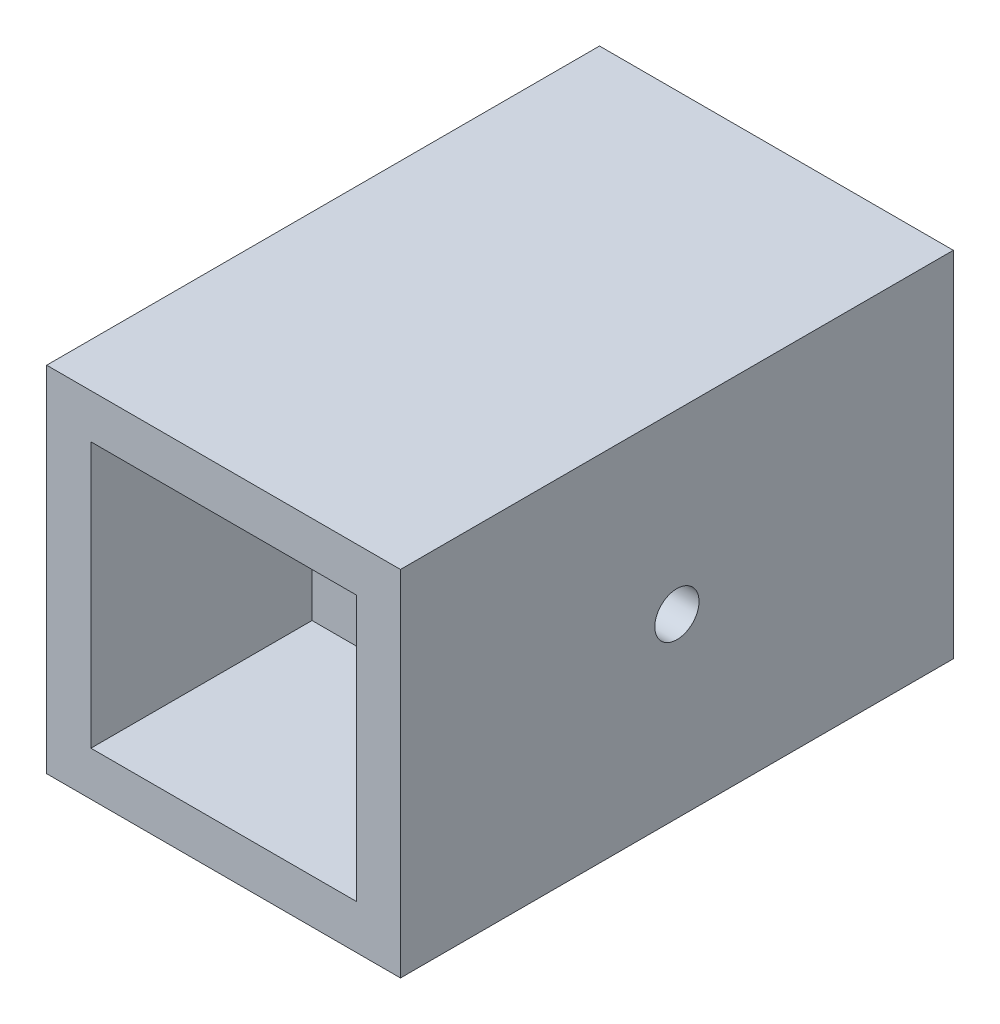
ISO-10303-21;
HEADER;
FILE_DESCRIPTION(('STEP AP214'),'2;1');
FILE_NAME('part.step','',(''),(''),'','','');
FILE_SCHEMA(('AUTOMOTIVE_DESIGN { 1 0 10303 214 1 1 1 1 }'));
ENDSEC;
DATA;
#1=APPLICATION_CONTEXT('core data for automotive mechanical design processes');
#2=APPLICATION_PROTOCOL_DEFINITION('international standard','automotive_design',2000,#1);
#3=PRODUCT_CONTEXT('',#1,'mechanical');
#4=PRODUCT('Part','Part','',(#3));
#5=PRODUCT_RELATED_PRODUCT_CATEGORY('part','',(#4));
#6=PRODUCT_DEFINITION_FORMATION('','',#4);
#7=PRODUCT_DEFINITION_CONTEXT('part definition',#1,'design');
#8=PRODUCT_DEFINITION('design','',#6,#7);
#9=PRODUCT_DEFINITION_SHAPE('','',#8);
#10=(LENGTH_UNIT() NAMED_UNIT(*) SI_UNIT(.MILLI.,.METRE.));
#11=(NAMED_UNIT(*) PLANE_ANGLE_UNIT() SI_UNIT($,.RADIAN.));
#12=(NAMED_UNIT(*) SI_UNIT($,.STERADIAN.) SOLID_ANGLE_UNIT());
#13=UNCERTAINTY_MEASURE_WITH_UNIT(LENGTH_MEASURE(1.E-05),#10,'distance_accuracy_value','');
#14=(GEOMETRIC_REPRESENTATION_CONTEXT(3) GLOBAL_UNCERTAINTY_ASSIGNED_CONTEXT((#13)) GLOBAL_UNIT_ASSIGNED_CONTEXT((#10,
#11,#12)) REPRESENTATION_CONTEXT('',''));
#15=CARTESIAN_POINT('',(0.,0.,0.));
#16=DIRECTION('',(0.,0.,1.));
#17=DIRECTION('',(1.,0.,0.));
#18=AXIS2_PLACEMENT_3D('',#15,#16,#17);
#19=CARTESIAN_POINT('',(0.,0.,25.));
#20=DIRECTION('',(1.,0.,0.));
#21=DIRECTION('',(0.,0.,-1.));
#22=AXIS2_PLACEMENT_3D('',#19,#20,#21);
#23=PLANE('',#22);
#24=CARTESIAN_POINT('',(0.,8.,12.5));
#25=DIRECTION('',(1.,0.,0.));
#26=DIRECTION('',(0.,0.,-1.));
#27=AXIS2_PLACEMENT_3D('',#24,#25,#26);
#28=CIRCLE('',#27,1.);
#29=CARTESIAN_POINT('',(0.,8.,11.5));
#30=VERTEX_POINT('',#29);
#31=EDGE_CURVE('E150',#30,#30,#28,.T.);
#32=ORIENTED_EDGE('',*,*,#31,.T.);
#33=EDGE_LOOP('',(#32));
#34=FACE_BOUND('',#33,.T.);
#35=DIRECTION('',(0.,-1.,0.));
#36=VECTOR('',#35,1.);
#37=CARTESIAN_POINT('',(0.,0.,0.));
#38=LINE('',#37,#36);
#39=CARTESIAN_POINT('',(0.,16.,0.));
#40=VERTEX_POINT('',#39);
#41=CARTESIAN_POINT('',(0.,0.,0.));
#42=VERTEX_POINT('',#41);
#43=EDGE_CURVE('E190',#40,#42,#38,.T.);
#44=ORIENTED_EDGE('',*,*,#43,.T.);
#45=DIRECTION('',(0.,0.,-1.));
#46=VECTOR('',#45,1.);
#47=CARTESIAN_POINT('',(0.,0.,25.));
#48=LINE('',#47,#46);
#49=CARTESIAN_POINT('',(0.,0.,25.));
#50=VERTEX_POINT('',#49);
#51=EDGE_CURVE('E11',#50,#42,#48,.T.);
#52=ORIENTED_EDGE('',*,*,#51,.F.);
#53=DIRECTION('',(0.,-1.,0.));
#54=VECTOR('',#53,1.);
#55=CARTESIAN_POINT('',(0.,0.,25.));
#56=LINE('',#55,#54);
#57=CARTESIAN_POINT('',(0.,16.,25.));
#58=VERTEX_POINT('',#57);
#59=EDGE_CURVE('E196',#58,#50,#56,.T.);
#60=ORIENTED_EDGE('',*,*,#59,.F.);
#61=DIRECTION('',(0.,0.,-1.));
#62=VECTOR('',#61,1.);
#63=CARTESIAN_POINT('',(0.,16.,25.));
#64=LINE('',#63,#62);
#65=EDGE_CURVE('E206',#58,#40,#64,.T.);
#66=ORIENTED_EDGE('',*,*,#65,.T.);
#67=EDGE_LOOP('',(#44,#52,#60,#66));
#68=FACE_BOUND('',#67,.T.);
#69=ADVANCED_FACE('F36',(#34,#68),#23,.F.);
#70=CARTESIAN_POINT('',(0.,0.,25.));
#71=DIRECTION('',(0.,1.,0.));
#72=DIRECTION('',(0.,0.,1.));
#73=AXIS2_PLACEMENT_3D('',#70,#71,#72);
#74=PLANE('',#73);
#75=DIRECTION('',(1.,0.,0.));
#76=VECTOR('',#75,1.);
#77=CARTESIAN_POINT('',(0.,0.,0.));
#78=LINE('',#77,#76);
#79=CARTESIAN_POINT('',(16.,0.,0.));
#80=VERTEX_POINT('',#79);
#81=EDGE_CURVE('E209',#42,#80,#78,.T.);
#82=ORIENTED_EDGE('',*,*,#81,.T.);
#83=DIRECTION('',(0.,0.,-1.));
#84=VECTOR('',#83,1.);
#85=CARTESIAN_POINT('',(16.,0.,25.));
#86=LINE('',#85,#84);
#87=CARTESIAN_POINT('',(16.,0.,25.));
#88=VERTEX_POINT('',#87);
#89=EDGE_CURVE('E43',#88,#80,#86,.T.);
#90=ORIENTED_EDGE('',*,*,#89,.F.);
#91=DIRECTION('',(1.,0.,0.));
#92=VECTOR('',#91,1.);
#93=CARTESIAN_POINT('',(0.,0.,25.));
#94=LINE('',#93,#92);
#95=EDGE_CURVE('E199',#50,#88,#94,.T.);
#96=ORIENTED_EDGE('',*,*,#95,.F.);
#97=ORIENTED_EDGE('',*,*,#51,.T.);
#98=EDGE_LOOP('',(#82,#90,#96,#97));
#99=FACE_BOUND('',#98,.T.);
#100=ADVANCED_FACE('F239',(#99),#74,.F.);
#101=CARTESIAN_POINT('',(16.,0.,25.));
#102=DIRECTION('',(-1.,0.,0.));
#103=DIRECTION('',(0.,0.,1.));
#104=AXIS2_PLACEMENT_3D('',#101,#102,#103);
#105=PLANE('',#104);
#106=CARTESIAN_POINT('',(16.,8.,12.5));
#107=DIRECTION('',(1.,0.,0.));
#108=DIRECTION('',(0.,0.,-1.));
#109=AXIS2_PLACEMENT_3D('',#106,#107,#108);
#110=CIRCLE('',#109,1.);
#111=CARTESIAN_POINT('',(16.,8.,11.5));
#112=VERTEX_POINT('',#111);
#113=EDGE_CURVE('E298',#112,#112,#110,.T.);
#114=ORIENTED_EDGE('',*,*,#113,.F.);
#115=EDGE_LOOP('',(#114));
#116=FACE_BOUND('',#115,.T.);
#117=DIRECTION('',(0.,1.,0.));
#118=VECTOR('',#117,1.);
#119=CARTESIAN_POINT('',(16.,0.,0.));
#120=LINE('',#119,#118);
#121=CARTESIAN_POINT('',(16.,16.,0.));
#122=VERTEX_POINT('',#121);
#123=EDGE_CURVE('E211',#80,#122,#120,.T.);
#124=ORIENTED_EDGE('',*,*,#123,.T.);
#125=DIRECTION('',(0.,0.,-1.));
#126=VECTOR('',#125,1.);
#127=CARTESIAN_POINT('',(16.,16.,25.));
#128=LINE('',#127,#126);
#129=CARTESIAN_POINT('',(16.,16.,25.));
#130=VERTEX_POINT('',#129);
#131=EDGE_CURVE('E216',#130,#122,#128,.T.);
#132=ORIENTED_EDGE('',*,*,#131,.F.);
#133=DIRECTION('',(0.,1.,0.));
#134=VECTOR('',#133,1.);
#135=CARTESIAN_POINT('',(16.,0.,25.));
#136=LINE('',#135,#134);
#137=EDGE_CURVE('E202',#88,#130,#136,.T.);
#138=ORIENTED_EDGE('',*,*,#137,.F.);
#139=ORIENTED_EDGE('',*,*,#89,.T.);
#140=EDGE_LOOP('',(#124,#132,#138,#139));
#141=FACE_BOUND('',#140,.T.);
#142=ADVANCED_FACE('F223',(#116,#141),#105,.F.);
#143=CARTESIAN_POINT('',(0.,16.,25.));
#144=DIRECTION('',(0.,-1.,0.));
#145=DIRECTION('',(0.,0.,-1.));
#146=AXIS2_PLACEMENT_3D('',#143,#144,#145);
#147=PLANE('',#146);
#148=DIRECTION('',(-1.,0.,0.));
#149=VECTOR('',#148,1.);
#150=CARTESIAN_POINT('',(0.,16.,0.));
#151=LINE('',#150,#149);
#152=EDGE_CURVE('E200',#122,#40,#151,.T.);
#153=ORIENTED_EDGE('',*,*,#152,.T.);
#154=ORIENTED_EDGE('',*,*,#65,.F.);
#155=DIRECTION('',(-1.,0.,0.));
#156=VECTOR('',#155,1.);
#157=CARTESIAN_POINT('',(0.,16.,25.));
#158=LINE('',#157,#156);
#159=EDGE_CURVE('E204',#130,#58,#158,.T.);
#160=ORIENTED_EDGE('',*,*,#159,.F.);
#161=ORIENTED_EDGE('',*,*,#131,.T.);
#162=EDGE_LOOP('',(#153,#154,#160,#161));
#163=FACE_BOUND('',#162,.T.);
#164=ADVANCED_FACE('F232',(#163),#147,.F.);
#165=CARTESIAN_POINT('',(0.,0.,25.));
#166=DIRECTION('',(0.,0.,-1.));
#167=DIRECTION('',(-1.,0.,0.));
#168=AXIS2_PLACEMENT_3D('',#165,#166,#167);
#169=PLANE('',#168);
#170=DIRECTION('',(1.,0.,0.));
#171=VECTOR('',#170,1.);
#172=CARTESIAN_POINT('',(2.,2.,25.));
#173=LINE('',#172,#171);
#174=CARTESIAN_POINT('',(2.,2.,25.));
#175=VERTEX_POINT('',#174);
#176=CARTESIAN_POINT('',(14.,2.,25.));
#177=VERTEX_POINT('',#176);
#178=EDGE_CURVE('E156',#175,#177,#173,.T.);
#179=ORIENTED_EDGE('',*,*,#178,.F.);
#180=DIRECTION('',(0.,-1.,0.));
#181=VECTOR('',#180,1.);
#182=CARTESIAN_POINT('',(2.,2.,25.));
#183=LINE('',#182,#181);
#184=CARTESIAN_POINT('',(2.,14.,25.));
#185=VERTEX_POINT('',#184);
#186=EDGE_CURVE('E50',#185,#175,#183,.T.);
#187=ORIENTED_EDGE('',*,*,#186,.F.);
#188=DIRECTION('',(-1.,0.,0.));
#189=VECTOR('',#188,1.);
#190=CARTESIAN_POINT('',(2.,14.,25.));
#191=LINE('',#190,#189);
#192=CARTESIAN_POINT('',(14.,14.,25.));
#193=VERTEX_POINT('',#192);
#194=EDGE_CURVE('E144',#193,#185,#191,.T.);
#195=ORIENTED_EDGE('',*,*,#194,.F.);
#196=DIRECTION('',(0.,1.,0.));
#197=VECTOR('',#196,1.);
#198=CARTESIAN_POINT('',(14.,2.,25.));
#199=LINE('',#198,#197);
#200=EDGE_CURVE('E147',#177,#193,#199,.T.);
#201=ORIENTED_EDGE('',*,*,#200,.F.);
#202=EDGE_LOOP('',(#179,#187,#195,#201));
#203=FACE_BOUND('',#202,.T.);
#204=ORIENTED_EDGE('',*,*,#59,.T.);
#205=ORIENTED_EDGE('',*,*,#95,.T.);
#206=ORIENTED_EDGE('',*,*,#137,.T.);
#207=ORIENTED_EDGE('',*,*,#159,.T.);
#208=EDGE_LOOP('',(#204,#205,#206,#207));
#209=FACE_BOUND('',#208,.T.);
#210=ADVANCED_FACE('F238',(#203,#209),#169,.F.);
#211=CARTESIAN_POINT('',(0.,0.,0.));
#212=DIRECTION('',(0.,0.,-1.));
#213=DIRECTION('',(-1.,0.,0.));
#214=AXIS2_PLACEMENT_3D('',#211,#212,#213);
#215=PLANE('',#214);
#216=DIRECTION('',(0.,1.,0.));
#217=VECTOR('',#216,1.);
#218=CARTESIAN_POINT('',(2.,2.,0.));
#219=LINE('',#218,#217);
#220=CARTESIAN_POINT('',(2.,2.,0.));
#221=VERTEX_POINT('',#220);
#222=CARTESIAN_POINT('',(2.,14.,0.));
#223=VERTEX_POINT('',#222);
#224=EDGE_CURVE('E58',#221,#223,#219,.T.);
#225=ORIENTED_EDGE('',*,*,#224,.F.);
#226=DIRECTION('',(-1.,0.,0.));
#227=VECTOR('',#226,1.);
#228=CARTESIAN_POINT('',(2.,2.,0.));
#229=LINE('',#228,#227);
#230=CARTESIAN_POINT('',(14.,2.,0.));
#231=VERTEX_POINT('',#230);
#232=EDGE_CURVE('E169',#231,#221,#229,.T.);
#233=ORIENTED_EDGE('',*,*,#232,.F.);
#234=DIRECTION('',(0.,-1.,0.));
#235=VECTOR('',#234,1.);
#236=CARTESIAN_POINT('',(14.,2.,0.));
#237=LINE('',#236,#235);
#238=CARTESIAN_POINT('',(14.,14.,0.));
#239=VERTEX_POINT('',#238);
#240=EDGE_CURVE('E183',#239,#231,#237,.T.);
#241=ORIENTED_EDGE('',*,*,#240,.F.);
#242=DIRECTION('',(1.,0.,0.));
#243=VECTOR('',#242,1.);
#244=CARTESIAN_POINT('',(2.,14.,0.));
#245=LINE('',#244,#243);
#246=EDGE_CURVE('E180',#223,#239,#245,.T.);
#247=ORIENTED_EDGE('',*,*,#246,.F.);
#248=EDGE_LOOP('',(#225,#233,#241,#247));
#249=FACE_BOUND('',#248,.T.);
#250=ORIENTED_EDGE('',*,*,#43,.F.);
#251=ORIENTED_EDGE('',*,*,#152,.F.);
#252=ORIENTED_EDGE('',*,*,#123,.F.);
#253=ORIENTED_EDGE('',*,*,#81,.F.);
#254=EDGE_LOOP('',(#250,#251,#252,#253));
#255=FACE_BOUND('',#254,.T.);
#256=ADVANCED_FACE('F229',(#249,#255),#215,.T.);
#257=CARTESIAN_POINT('',(2.,2.,10.));
#258=DIRECTION('',(-1.,0.,0.));
#259=DIRECTION('',(0.,0.,1.));
#260=AXIS2_PLACEMENT_3D('',#257,#258,#259);
#261=PLANE('',#260);
#262=ORIENTED_EDGE('',*,*,#224,.T.);
#263=DIRECTION('',(0.,0.,-1.));
#264=VECTOR('',#263,1.);
#265=CARTESIAN_POINT('',(2.,14.,10.));
#266=LINE('',#265,#264);
#267=CARTESIAN_POINT('',(2.,14.,10.));
#268=VERTEX_POINT('',#267);
#269=EDGE_CURVE('E178',#268,#223,#266,.T.);
#270=ORIENTED_EDGE('',*,*,#269,.F.);
#271=DIRECTION('',(0.,1.,0.));
#272=VECTOR('',#271,1.);
#273=CARTESIAN_POINT('',(2.,2.,10.));
#274=LINE('',#273,#272);
#275=CARTESIAN_POINT('',(2.,2.,10.));
#276=VERTEX_POINT('',#275);
#277=EDGE_CURVE('E165',#276,#268,#274,.T.);
#278=ORIENTED_EDGE('',*,*,#277,.F.);
#279=DIRECTION('',(0.,0.,-1.));
#280=VECTOR('',#279,1.);
#281=CARTESIAN_POINT('',(2.,2.,10.));
#282=LINE('',#281,#280);
#283=EDGE_CURVE('E188',#276,#221,#282,.T.);
#284=ORIENTED_EDGE('',*,*,#283,.T.);
#285=EDGE_LOOP('',(#262,#270,#278,#284));
#286=FACE_BOUND('',#285,.T.);
#287=ADVANCED_FACE('F253',(#286),#261,.F.);
#288=CARTESIAN_POINT('',(2.,2.,10.));
#289=DIRECTION('',(0.,-1.,0.));
#290=DIRECTION('',(0.,0.,-1.));
#291=AXIS2_PLACEMENT_3D('',#288,#289,#290);
#292=PLANE('',#291);
#293=ORIENTED_EDGE('',*,*,#232,.T.);
#294=ORIENTED_EDGE('',*,*,#283,.F.);
#295=DIRECTION('',(-1.,0.,0.));
#296=VECTOR('',#295,1.);
#297=CARTESIAN_POINT('',(2.,2.,10.));
#298=LINE('',#297,#296);
#299=CARTESIAN_POINT('',(14.,2.,10.));
#300=VERTEX_POINT('',#299);
#301=EDGE_CURVE('E175',#300,#276,#298,.T.);
#302=ORIENTED_EDGE('',*,*,#301,.F.);
#303=DIRECTION('',(0.,0.,-1.));
#304=VECTOR('',#303,1.);
#305=CARTESIAN_POINT('',(14.,2.,10.));
#306=LINE('',#305,#304);
#307=EDGE_CURVE('E191',#300,#231,#306,.T.);
#308=ORIENTED_EDGE('',*,*,#307,.T.);
#309=EDGE_LOOP('',(#293,#294,#302,#308));
#310=FACE_BOUND('',#309,.T.);
#311=ADVANCED_FACE('F260',(#310),#292,.F.);
#312=CARTESIAN_POINT('',(14.,2.,10.));
#313=DIRECTION('',(1.,0.,0.));
#314=DIRECTION('',(0.,0.,-1.));
#315=AXIS2_PLACEMENT_3D('',#312,#313,#314);
#316=PLANE('',#315);
#317=ORIENTED_EDGE('',*,*,#240,.T.);
#318=ORIENTED_EDGE('',*,*,#307,.F.);
#319=DIRECTION('',(0.,-1.,0.));
#320=VECTOR('',#319,1.);
#321=CARTESIAN_POINT('',(14.,2.,10.));
#322=LINE('',#321,#320);
#323=CARTESIAN_POINT('',(14.,14.,10.));
#324=VERTEX_POINT('',#323);
#325=EDGE_CURVE('E172',#324,#300,#322,.T.);
#326=ORIENTED_EDGE('',*,*,#325,.F.);
#327=DIRECTION('',(0.,0.,-1.));
#328=VECTOR('',#327,1.);
#329=CARTESIAN_POINT('',(14.,14.,10.));
#330=LINE('',#329,#328);
#331=EDGE_CURVE('E193',#324,#239,#330,.T.);
#332=ORIENTED_EDGE('',*,*,#331,.T.);
#333=EDGE_LOOP('',(#317,#318,#326,#332));
#334=FACE_BOUND('',#333,.T.);
#335=ADVANCED_FACE('F265',(#334),#316,.F.);
#336=CARTESIAN_POINT('',(2.,14.,10.));
#337=DIRECTION('',(0.,1.,0.));
#338=DIRECTION('',(-1.,0.,0.));
#339=AXIS2_PLACEMENT_3D('',#336,#337,#338);
#340=PLANE('',#339);
#341=ORIENTED_EDGE('',*,*,#246,.T.);
#342=ORIENTED_EDGE('',*,*,#331,.F.);
#343=DIRECTION('',(1.,0.,0.));
#344=VECTOR('',#343,1.);
#345=CARTESIAN_POINT('',(2.,14.,10.));
#346=LINE('',#345,#344);
#347=EDGE_CURVE('E168',#268,#324,#346,.T.);
#348=ORIENTED_EDGE('',*,*,#347,.F.);
#349=ORIENTED_EDGE('',*,*,#269,.T.);
#350=EDGE_LOOP('',(#341,#342,#348,#349));
#351=FACE_BOUND('',#350,.T.);
#352=ADVANCED_FACE('F261',(#351),#340,.F.);
#353=CARTESIAN_POINT('',(0.,0.,10.));
#354=DIRECTION('',(0.,0.,-1.));
#355=DIRECTION('',(-1.,0.,0.));
#356=AXIS2_PLACEMENT_3D('',#353,#354,#355);
#357=PLANE('',#356);
#358=ORIENTED_EDGE('',*,*,#277,.T.);
#359=ORIENTED_EDGE('',*,*,#347,.T.);
#360=ORIENTED_EDGE('',*,*,#325,.T.);
#361=ORIENTED_EDGE('',*,*,#301,.T.);
#362=EDGE_LOOP('',(#358,#359,#360,#361));
#363=FACE_BOUND('',#362,.T.);
#364=ADVANCED_FACE('F264',(#363),#357,.T.);
#365=CARTESIAN_POINT('',(2.,2.,15.));
#366=DIRECTION('',(-1.,0.,0.));
#367=DIRECTION('',(0.,0.,1.));
#368=AXIS2_PLACEMENT_3D('',#365,#366,#367);
#369=PLANE('',#368);
#370=ORIENTED_EDGE('',*,*,#186,.T.);
#371=DIRECTION('',(0.,0.,1.));
#372=VECTOR('',#371,1.);
#373=CARTESIAN_POINT('',(2.,2.,15.));
#374=LINE('',#373,#372);
#375=CARTESIAN_POINT('',(2.,2.,15.));
#376=VERTEX_POINT('',#375);
#377=EDGE_CURVE('E122',#376,#175,#374,.T.);
#378=ORIENTED_EDGE('',*,*,#377,.F.);
#379=DIRECTION('',(0.,-1.,0.));
#380=VECTOR('',#379,1.);
#381=CARTESIAN_POINT('',(2.,2.,15.));
#382=LINE('',#381,#380);
#383=CARTESIAN_POINT('',(2.,14.,15.));
#384=VERTEX_POINT('',#383);
#385=EDGE_CURVE('E126',#384,#376,#382,.T.);
#386=ORIENTED_EDGE('',*,*,#385,.F.);
#387=DIRECTION('',(0.,0.,1.));
#388=VECTOR('',#387,1.);
#389=CARTESIAN_POINT('',(2.,14.,15.));
#390=LINE('',#389,#388);
#391=EDGE_CURVE('E160',#384,#185,#390,.T.);
#392=ORIENTED_EDGE('',*,*,#391,.T.);
#393=EDGE_LOOP('',(#370,#378,#386,#392));
#394=FACE_BOUND('',#393,.T.);
#395=ADVANCED_FACE('F124',(#394),#369,.F.);
#396=CARTESIAN_POINT('',(2.,14.,15.));
#397=DIRECTION('',(0.,1.,0.));
#398=DIRECTION('',(0.,0.,1.));
#399=AXIS2_PLACEMENT_3D('',#396,#397,#398);
#400=PLANE('',#399);
#401=ORIENTED_EDGE('',*,*,#194,.T.);
#402=ORIENTED_EDGE('',*,*,#391,.F.);
#403=DIRECTION('',(-1.,0.,0.));
#404=VECTOR('',#403,1.);
#405=CARTESIAN_POINT('',(2.,14.,15.));
#406=LINE('',#405,#404);
#407=CARTESIAN_POINT('',(14.,14.,15.));
#408=VERTEX_POINT('',#407);
#409=EDGE_CURVE('E132',#408,#384,#406,.T.);
#410=ORIENTED_EDGE('',*,*,#409,.F.);
#411=DIRECTION('',(0.,0.,1.));
#412=VECTOR('',#411,1.);
#413=CARTESIAN_POINT('',(14.,14.,15.));
#414=LINE('',#413,#412);
#415=EDGE_CURVE('E162',#408,#193,#414,.T.);
#416=ORIENTED_EDGE('',*,*,#415,.T.);
#417=EDGE_LOOP('',(#401,#402,#410,#416));
#418=FACE_BOUND('',#417,.T.);
#419=ADVANCED_FACE('F278',(#418),#400,.F.);
#420=CARTESIAN_POINT('',(14.,2.,15.));
#421=DIRECTION('',(1.,0.,0.));
#422=DIRECTION('',(0.,0.,-1.));
#423=AXIS2_PLACEMENT_3D('',#420,#421,#422);
#424=PLANE('',#423);
#425=ORIENTED_EDGE('',*,*,#200,.T.);
#426=ORIENTED_EDGE('',*,*,#415,.F.);
#427=DIRECTION('',(0.,1.,0.));
#428=VECTOR('',#427,1.);
#429=CARTESIAN_POINT('',(14.,2.,15.));
#430=LINE('',#429,#428);
#431=CARTESIAN_POINT('',(14.,2.,15.));
#432=VERTEX_POINT('',#431);
#433=EDGE_CURVE('E140',#432,#408,#430,.T.);
#434=ORIENTED_EDGE('',*,*,#433,.F.);
#435=DIRECTION('',(0.,0.,1.));
#436=VECTOR('',#435,1.);
#437=CARTESIAN_POINT('',(14.,2.,15.));
#438=LINE('',#437,#436);
#439=EDGE_CURVE('E131',#432,#177,#438,.T.);
#440=ORIENTED_EDGE('',*,*,#439,.T.);
#441=EDGE_LOOP('',(#425,#426,#434,#440));
#442=FACE_BOUND('',#441,.T.);
#443=ADVANCED_FACE('F281',(#442),#424,.F.);
#444=CARTESIAN_POINT('',(2.,2.,15.));
#445=DIRECTION('',(0.,-1.,0.));
#446=DIRECTION('',(0.,0.,-1.));
#447=AXIS2_PLACEMENT_3D('',#444,#445,#446);
#448=PLANE('',#447);
#449=ORIENTED_EDGE('',*,*,#178,.T.);
#450=ORIENTED_EDGE('',*,*,#439,.F.);
#451=DIRECTION('',(1.,0.,0.));
#452=VECTOR('',#451,1.);
#453=CARTESIAN_POINT('',(2.,2.,15.));
#454=LINE('',#453,#452);
#455=EDGE_CURVE('E135',#376,#432,#454,.T.);
#456=ORIENTED_EDGE('',*,*,#455,.F.);
#457=ORIENTED_EDGE('',*,*,#377,.T.);
#458=EDGE_LOOP('',(#449,#450,#456,#457));
#459=FACE_BOUND('',#458,.T.);
#460=ADVANCED_FACE('F136',(#459),#448,.F.);
#461=CARTESIAN_POINT('',(0.,0.,15.));
#462=DIRECTION('',(0.,0.,-1.));
#463=DIRECTION('',(-1.,0.,0.));
#464=AXIS2_PLACEMENT_3D('',#461,#462,#463);
#465=PLANE('',#464);
#466=ORIENTED_EDGE('',*,*,#385,.T.);
#467=ORIENTED_EDGE('',*,*,#455,.T.);
#468=ORIENTED_EDGE('',*,*,#433,.T.);
#469=ORIENTED_EDGE('',*,*,#409,.T.);
#470=EDGE_LOOP('',(#466,#467,#468,#469));
#471=FACE_BOUND('',#470,.T.);
#472=ADVANCED_FACE('F142',(#471),#465,.F.);
#473=CARTESIAN_POINT('',(-2.,8.,12.5));
#474=DIRECTION('',(1.,0.,0.));
#475=DIRECTION('',(0.,0.,-1.));
#476=AXIS2_PLACEMENT_3D('',#473,#474,#475);
#477=CYLINDRICAL_SURFACE('',#476,1.);
#478=ORIENTED_EDGE('',*,*,#113,.T.);
#479=EDGE_LOOP('',(#478));
#480=FACE_BOUND('',#479,.T.);
#481=ORIENTED_EDGE('',*,*,#31,.F.);
#482=EDGE_LOOP('',(#481));
#483=FACE_BOUND('',#482,.T.);
#484=ADVANCED_FACE('F290',(#480,#483),#477,.F.);
#485=CLOSED_SHELL('',(#69,#100,#142,#164,#210,#256,#287,#311,#335,#352,#364,#395,#419,#443,#460,
#472,#484));
#486=MANIFOLD_SOLID_BREP('B2',#485);
#487=ADVANCED_BREP_SHAPE_REPRESENTATION('',(#18,#486),#14);
#488=SHAPE_DEFINITION_REPRESENTATION(#9,#487);
ENDSEC;
END-ISO-10303-21;
